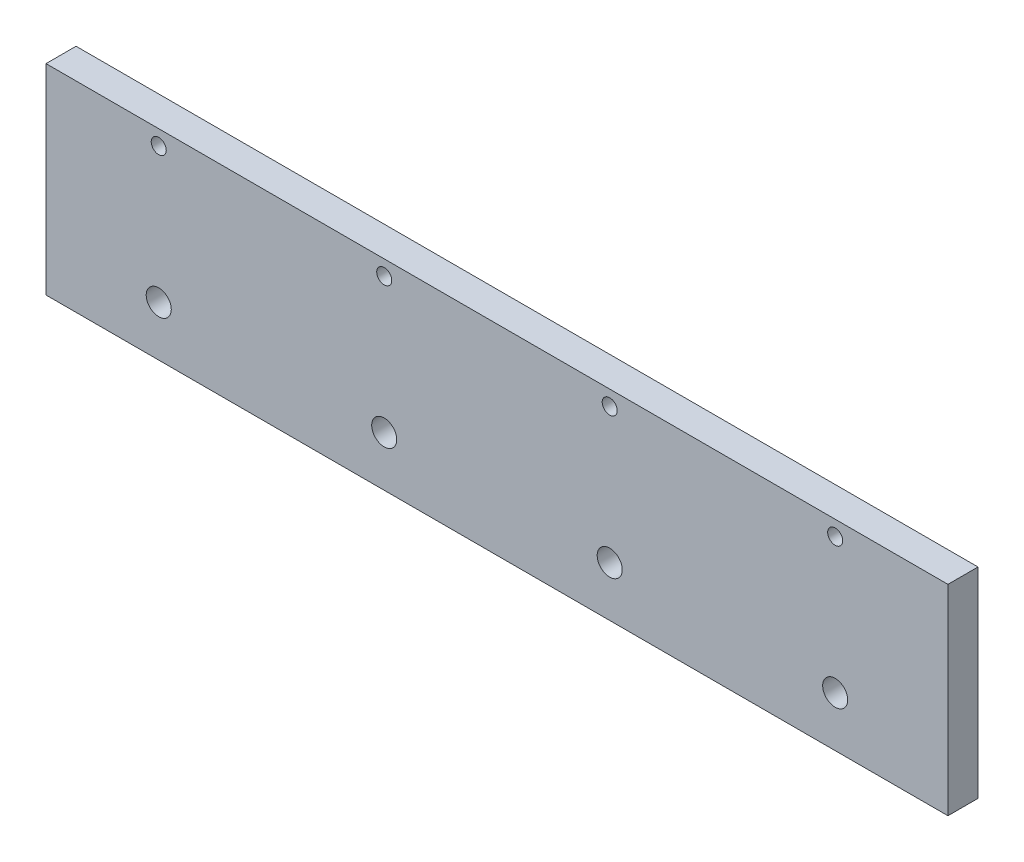
ISO-10303-21;
HEADER;
FILE_DESCRIPTION(('STEP AP214'),'2;1');
FILE_NAME('part.step','',(''),(''),'','','');
FILE_SCHEMA(('AUTOMOTIVE_DESIGN { 1 0 10303 214 1 1 1 1 }'));
ENDSEC;
DATA;
#1=APPLICATION_CONTEXT('core data for automotive mechanical design processes');
#2=APPLICATION_PROTOCOL_DEFINITION('international standard','automotive_design',2000,#1);
#3=PRODUCT_CONTEXT('',#1,'mechanical');
#4=PRODUCT('Part','Part','',(#3));
#5=PRODUCT_RELATED_PRODUCT_CATEGORY('part','',(#4));
#6=PRODUCT_DEFINITION_FORMATION('','',#4);
#7=PRODUCT_DEFINITION_CONTEXT('part definition',#1,'design');
#8=PRODUCT_DEFINITION('design','',#6,#7);
#9=PRODUCT_DEFINITION_SHAPE('','',#8);
#10=(LENGTH_UNIT() NAMED_UNIT(*) SI_UNIT(.MILLI.,.METRE.));
#11=(NAMED_UNIT(*) PLANE_ANGLE_UNIT() SI_UNIT($,.RADIAN.));
#12=(NAMED_UNIT(*) SI_UNIT($,.STERADIAN.) SOLID_ANGLE_UNIT());
#13=UNCERTAINTY_MEASURE_WITH_UNIT(LENGTH_MEASURE(1.E-05),#10,'distance_accuracy_value','');
#14=(GEOMETRIC_REPRESENTATION_CONTEXT(3) GLOBAL_UNCERTAINTY_ASSIGNED_CONTEXT((#13)) GLOBAL_UNIT_ASSIGNED_CONTEXT((#10,
#11,#12)) REPRESENTATION_CONTEXT('',''));
#15=CARTESIAN_POINT('',(0.,0.,0.));
#16=DIRECTION('',(0.,0.,1.));
#17=DIRECTION('',(1.,0.,0.));
#18=AXIS2_PLACEMENT_3D('',#15,#16,#17);
#19=CARTESIAN_POINT('',(180.,-40.,12.));
#20=DIRECTION('',(-1.,0.,0.));
#21=DIRECTION('',(0.,0.,1.));
#22=AXIS2_PLACEMENT_3D('',#19,#20,#21);
#23=PLANE('',#22);
#24=DIRECTION('',(0.,1.,0.));
#25=VECTOR('',#24,1.);
#26=CARTESIAN_POINT('',(180.,-40.,0.));
#27=LINE('',#26,#25);
#28=CARTESIAN_POINT('',(180.,-40.,0.));
#29=VERTEX_POINT('',#28);
#30=CARTESIAN_POINT('',(180.,40.,0.));
#31=VERTEX_POINT('',#30);
#32=EDGE_CURVE('E101',#29,#31,#27,.T.);
#33=ORIENTED_EDGE('',*,*,#32,.T.);
#34=DIRECTION('',(0.,0.,-1.));
#35=VECTOR('',#34,1.);
#36=CARTESIAN_POINT('',(180.,40.,12.));
#37=LINE('',#36,#35);
#38=CARTESIAN_POINT('',(180.,40.,12.));
#39=VERTEX_POINT('',#38);
#40=EDGE_CURVE('E92',#39,#31,#37,.T.);
#41=ORIENTED_EDGE('',*,*,#40,.F.);
#42=DIRECTION('',(0.,1.,0.));
#43=VECTOR('',#42,1.);
#44=CARTESIAN_POINT('',(180.,-40.,12.));
#45=LINE('',#44,#43);
#46=CARTESIAN_POINT('',(180.,-40.,12.));
#47=VERTEX_POINT('',#46);
#48=EDGE_CURVE('E86',#47,#39,#45,.T.);
#49=ORIENTED_EDGE('',*,*,#48,.F.);
#50=DIRECTION('',(0.,0.,-1.));
#51=VECTOR('',#50,1.);
#52=CARTESIAN_POINT('',(180.,-40.,12.));
#53=LINE('',#52,#51);
#54=EDGE_CURVE('E97',#47,#29,#53,.T.);
#55=ORIENTED_EDGE('',*,*,#54,.T.);
#56=EDGE_LOOP('',(#33,#41,#49,#55));
#57=FACE_BOUND('',#56,.T.);
#58=ADVANCED_FACE('F32',(#57),#23,.F.);
#59=CARTESIAN_POINT('',(-180.,40.,12.));
#60=DIRECTION('',(0.,-1.,0.));
#61=DIRECTION('',(0.,0.,-1.));
#62=AXIS2_PLACEMENT_3D('',#59,#60,#61);
#63=PLANE('',#62);
#64=DIRECTION('',(-1.,0.,0.));
#65=VECTOR('',#64,1.);
#66=CARTESIAN_POINT('',(-180.,40.,0.));
#67=LINE('',#66,#65);
#68=CARTESIAN_POINT('',(-180.,40.,0.));
#69=VERTEX_POINT('',#68);
#70=EDGE_CURVE('E91',#31,#69,#67,.T.);
#71=ORIENTED_EDGE('',*,*,#70,.T.);
#72=DIRECTION('',(0.,0.,-1.));
#73=VECTOR('',#72,1.);
#74=CARTESIAN_POINT('',(-180.,40.,12.));
#75=LINE('',#74,#73);
#76=CARTESIAN_POINT('',(-180.,40.,12.));
#77=VERTEX_POINT('',#76);
#78=EDGE_CURVE('E89',#77,#69,#75,.T.);
#79=ORIENTED_EDGE('',*,*,#78,.F.);
#80=DIRECTION('',(-1.,0.,0.));
#81=VECTOR('',#80,1.);
#82=CARTESIAN_POINT('',(-180.,40.,12.));
#83=LINE('',#82,#81);
#84=EDGE_CURVE('E80',#39,#77,#83,.T.);
#85=ORIENTED_EDGE('',*,*,#84,.F.);
#86=ORIENTED_EDGE('',*,*,#40,.T.);
#87=EDGE_LOOP('',(#71,#79,#85,#86));
#88=FACE_BOUND('',#87,.T.);
#89=ADVANCED_FACE('F90',(#88),#63,.F.);
#90=CARTESIAN_POINT('',(-180.,-40.,12.));
#91=DIRECTION('',(1.,0.,0.));
#92=DIRECTION('',(0.,0.,-1.));
#93=AXIS2_PLACEMENT_3D('',#90,#91,#92);
#94=PLANE('',#93);
#95=DIRECTION('',(0.,-1.,0.));
#96=VECTOR('',#95,1.);
#97=CARTESIAN_POINT('',(-180.,-40.,0.));
#98=LINE('',#97,#96);
#99=CARTESIAN_POINT('',(-180.,-40.,0.));
#100=VERTEX_POINT('',#99);
#101=EDGE_CURVE('E66',#69,#100,#98,.T.);
#102=ORIENTED_EDGE('',*,*,#101,.T.);
#103=DIRECTION('',(0.,0.,-1.));
#104=VECTOR('',#103,1.);
#105=CARTESIAN_POINT('',(-180.,-40.,12.));
#106=LINE('',#105,#104);
#107=CARTESIAN_POINT('',(-180.,-40.,12.));
#108=VERTEX_POINT('',#107);
#109=EDGE_CURVE('E93',#108,#100,#106,.T.);
#110=ORIENTED_EDGE('',*,*,#109,.F.);
#111=DIRECTION('',(0.,-1.,0.));
#112=VECTOR('',#111,1.);
#113=CARTESIAN_POINT('',(-180.,-40.,12.));
#114=LINE('',#113,#112);
#115=EDGE_CURVE('E84',#77,#108,#114,.T.);
#116=ORIENTED_EDGE('',*,*,#115,.F.);
#117=ORIENTED_EDGE('',*,*,#78,.T.);
#118=EDGE_LOOP('',(#102,#110,#116,#117));
#119=FACE_BOUND('',#118,.T.);
#120=ADVANCED_FACE('F95',(#119),#94,.F.);
#121=CARTESIAN_POINT('',(-180.,-40.,12.));
#122=DIRECTION('',(0.,1.,0.));
#123=DIRECTION('',(0.,0.,1.));
#124=AXIS2_PLACEMENT_3D('',#121,#122,#123);
#125=PLANE('',#124);
#126=DIRECTION('',(1.,0.,0.));
#127=VECTOR('',#126,1.);
#128=CARTESIAN_POINT('',(-180.,-40.,0.));
#129=LINE('',#128,#127);
#130=EDGE_CURVE('E72',#100,#29,#129,.T.);
#131=ORIENTED_EDGE('',*,*,#130,.T.);
#132=ORIENTED_EDGE('',*,*,#54,.F.);
#133=DIRECTION('',(1.,0.,0.));
#134=VECTOR('',#133,1.);
#135=CARTESIAN_POINT('',(-180.,-40.,12.));
#136=LINE('',#135,#134);
#137=EDGE_CURVE('E49',#108,#47,#136,.T.);
#138=ORIENTED_EDGE('',*,*,#137,.F.);
#139=ORIENTED_EDGE('',*,*,#109,.T.);
#140=EDGE_LOOP('',(#131,#132,#138,#139));
#141=FACE_BOUND('',#140,.T.);
#142=ADVANCED_FACE('F139',(#141),#125,.F.);
#143=CARTESIAN_POINT('',(180.,40.,12.));
#144=DIRECTION('',(0.,0.,-1.));
#145=DIRECTION('',(-1.,0.,0.));
#146=AXIS2_PLACEMENT_3D('',#143,#144,#145);
#147=PLANE('',#146);
#148=CARTESIAN_POINT('',(-45.,34.,12.));
#149=DIRECTION('',(0.,0.,1.));
#150=DIRECTION('',(1.,0.,0.));
#151=AXIS2_PLACEMENT_3D('',#148,#149,#150);
#152=CIRCLE('',#151,2.99999999999999);
#153=CARTESIAN_POINT('',(-42.,34.,12.));
#154=VERTEX_POINT('',#153);
#155=EDGE_CURVE('E222',#154,#154,#152,.T.);
#156=ORIENTED_EDGE('',*,*,#155,.F.);
#157=EDGE_LOOP('',(#156));
#158=FACE_BOUND('',#157,.T.);
#159=CARTESIAN_POINT('',(-45.,-20.,12.));
#160=DIRECTION('',(0.,0.,1.));
#161=DIRECTION('',(1.,0.,0.));
#162=AXIS2_PLACEMENT_3D('',#159,#160,#161);
#163=CIRCLE('',#162,4.99999999999999);
#164=CARTESIAN_POINT('',(-40.,-20.,12.));
#165=VERTEX_POINT('',#164);
#166=EDGE_CURVE('E214',#165,#165,#163,.T.);
#167=ORIENTED_EDGE('',*,*,#166,.F.);
#168=EDGE_LOOP('',(#167));
#169=FACE_BOUND('',#168,.T.);
#170=CARTESIAN_POINT('',(-135.,-20.,12.));
#171=DIRECTION('',(0.,0.,1.));
#172=DIRECTION('',(1.,0.,0.));
#173=AXIS2_PLACEMENT_3D('',#170,#171,#172);
#174=CIRCLE('',#173,4.99999999999999);
#175=CARTESIAN_POINT('',(-130.,-20.,12.));
#176=VERTEX_POINT('',#175);
#177=EDGE_CURVE('E208',#176,#176,#174,.T.);
#178=ORIENTED_EDGE('',*,*,#177,.F.);
#179=EDGE_LOOP('',(#178));
#180=FACE_BOUND('',#179,.T.);
#181=CARTESIAN_POINT('',(-135.,34.,12.));
#182=DIRECTION('',(0.,0.,1.));
#183=DIRECTION('',(1.,0.,0.));
#184=AXIS2_PLACEMENT_3D('',#181,#182,#183);
#185=CIRCLE('',#184,2.99999999999999);
#186=CARTESIAN_POINT('',(-132.,34.,12.));
#187=VERTEX_POINT('',#186);
#188=EDGE_CURVE('E104',#187,#187,#185,.T.);
#189=ORIENTED_EDGE('',*,*,#188,.F.);
#190=EDGE_LOOP('',(#189));
#191=FACE_BOUND('',#190,.T.);
#192=ORIENTED_EDGE('',*,*,#48,.T.);
#193=ORIENTED_EDGE('',*,*,#84,.T.);
#194=ORIENTED_EDGE('',*,*,#115,.T.);
#195=ORIENTED_EDGE('',*,*,#137,.T.);
#196=EDGE_LOOP('',(#192,#193,#194,#195));
#197=FACE_BOUND('',#196,.T.);
#198=CARTESIAN_POINT('',(45.,-20.,12.));
#199=DIRECTION('',(0.,0.,1.));
#200=DIRECTION('',(1.,0.,0.));
#201=AXIS2_PLACEMENT_3D('',#198,#199,#200);
#202=CIRCLE('',#201,4.99999999999999);
#203=CARTESIAN_POINT('',(50.,-20.,12.));
#204=VERTEX_POINT('',#203);
#205=EDGE_CURVE('E114',#204,#204,#202,.T.);
#206=ORIENTED_EDGE('',*,*,#205,.F.);
#207=EDGE_LOOP('',(#206));
#208=FACE_BOUND('',#207,.T.);
#209=CARTESIAN_POINT('',(135.,-20.,12.));
#210=DIRECTION('',(0.,0.,1.));
#211=DIRECTION('',(1.,0.,0.));
#212=AXIS2_PLACEMENT_3D('',#209,#210,#211);
#213=CIRCLE('',#212,4.99999999999999);
#214=CARTESIAN_POINT('',(140.,-20.,12.));
#215=VERTEX_POINT('',#214);
#216=EDGE_CURVE('E120',#215,#215,#213,.T.);
#217=ORIENTED_EDGE('',*,*,#216,.F.);
#218=EDGE_LOOP('',(#217));
#219=FACE_BOUND('',#218,.T.);
#220=CARTESIAN_POINT('',(45.,34.,12.));
#221=DIRECTION('',(0.,0.,1.));
#222=DIRECTION('',(1.,0.,0.));
#223=AXIS2_PLACEMENT_3D('',#220,#221,#222);
#224=CIRCLE('',#223,2.99999999999999);
#225=CARTESIAN_POINT('',(48.,34.,12.));
#226=VERTEX_POINT('',#225);
#227=EDGE_CURVE('E126',#226,#226,#224,.T.);
#228=ORIENTED_EDGE('',*,*,#227,.F.);
#229=EDGE_LOOP('',(#228));
#230=FACE_BOUND('',#229,.T.);
#231=CARTESIAN_POINT('',(135.,34.,12.));
#232=DIRECTION('',(0.,0.,1.));
#233=DIRECTION('',(1.,0.,0.));
#234=AXIS2_PLACEMENT_3D('',#231,#232,#233);
#235=CIRCLE('',#234,2.99999999999999);
#236=CARTESIAN_POINT('',(138.,34.,12.));
#237=VERTEX_POINT('',#236);
#238=EDGE_CURVE('E11',#237,#237,#235,.T.);
#239=ORIENTED_EDGE('',*,*,#238,.F.);
#240=EDGE_LOOP('',(#239));
#241=FACE_BOUND('',#240,.T.);
#242=ADVANCED_FACE('F81',(#158,#169,#180,#191,#197,#208,#219,#230,#241),#147,.F.);
#243=CARTESIAN_POINT('',(180.,40.,0.));
#244=DIRECTION('',(0.,0.,-1.));
#245=DIRECTION('',(-1.,0.,0.));
#246=AXIS2_PLACEMENT_3D('',#243,#244,#245);
#247=PLANE('',#246);
#248=CARTESIAN_POINT('',(-45.,34.,0.));
#249=DIRECTION('',(0.,0.,-1.));
#250=DIRECTION('',(-1.,0.,0.));
#251=AXIS2_PLACEMENT_3D('',#248,#249,#250);
#252=CIRCLE('',#251,2.99999999999999);
#253=CARTESIAN_POINT('',(-48.,34.,0.));
#254=VERTEX_POINT('',#253);
#255=EDGE_CURVE('E225',#254,#254,#252,.F.);
#256=ORIENTED_EDGE('',*,*,#255,.T.);
#257=EDGE_LOOP('',(#256));
#258=FACE_BOUND('',#257,.T.);
#259=CARTESIAN_POINT('',(-45.,-20.,0.));
#260=DIRECTION('',(0.,0.,-1.));
#261=DIRECTION('',(-1.,0.,0.));
#262=AXIS2_PLACEMENT_3D('',#259,#260,#261);
#263=CIRCLE('',#262,4.99999999999999);
#264=CARTESIAN_POINT('',(-50.,-20.,0.));
#265=VERTEX_POINT('',#264);
#266=EDGE_CURVE('E219',#265,#265,#263,.F.);
#267=ORIENTED_EDGE('',*,*,#266,.T.);
#268=EDGE_LOOP('',(#267));
#269=FACE_BOUND('',#268,.T.);
#270=CARTESIAN_POINT('',(-135.,-20.,0.));
#271=DIRECTION('',(0.,0.,-1.));
#272=DIRECTION('',(-1.,0.,0.));
#273=AXIS2_PLACEMENT_3D('',#270,#271,#272);
#274=CIRCLE('',#273,4.99999999999999);
#275=CARTESIAN_POINT('',(-140.,-20.,0.));
#276=VERTEX_POINT('',#275);
#277=EDGE_CURVE('E211',#276,#276,#274,.F.);
#278=ORIENTED_EDGE('',*,*,#277,.T.);
#279=EDGE_LOOP('',(#278));
#280=FACE_BOUND('',#279,.T.);
#281=CARTESIAN_POINT('',(-135.,34.,0.));
#282=DIRECTION('',(0.,0.,-1.));
#283=DIRECTION('',(-1.,0.,0.));
#284=AXIS2_PLACEMENT_3D('',#281,#282,#283);
#285=CIRCLE('',#284,2.99999999999999);
#286=CARTESIAN_POINT('',(-138.,34.,0.));
#287=VERTEX_POINT('',#286);
#288=EDGE_CURVE('E203',#287,#287,#285,.F.);
#289=ORIENTED_EDGE('',*,*,#288,.T.);
#290=EDGE_LOOP('',(#289));
#291=FACE_BOUND('',#290,.T.);
#292=ORIENTED_EDGE('',*,*,#32,.F.);
#293=ORIENTED_EDGE('',*,*,#130,.F.);
#294=ORIENTED_EDGE('',*,*,#101,.F.);
#295=ORIENTED_EDGE('',*,*,#70,.F.);
#296=EDGE_LOOP('',(#292,#293,#294,#295));
#297=FACE_BOUND('',#296,.T.);
#298=CARTESIAN_POINT('',(45.,-20.,0.));
#299=DIRECTION('',(0.,0.,-1.));
#300=DIRECTION('',(-1.,0.,0.));
#301=AXIS2_PLACEMENT_3D('',#298,#299,#300);
#302=CIRCLE('',#301,4.99999999999999);
#303=CARTESIAN_POINT('',(40.,-20.,0.));
#304=VERTEX_POINT('',#303);
#305=EDGE_CURVE('E111',#304,#304,#302,.F.);
#306=ORIENTED_EDGE('',*,*,#305,.T.);
#307=EDGE_LOOP('',(#306));
#308=FACE_BOUND('',#307,.T.);
#309=CARTESIAN_POINT('',(135.,-20.,0.));
#310=DIRECTION('',(0.,0.,-1.));
#311=DIRECTION('',(-1.,0.,0.));
#312=AXIS2_PLACEMENT_3D('',#309,#310,#311);
#313=CIRCLE('',#312,4.99999999999999);
#314=CARTESIAN_POINT('',(130.,-20.,0.));
#315=VERTEX_POINT('',#314);
#316=EDGE_CURVE('E117',#315,#315,#313,.F.);
#317=ORIENTED_EDGE('',*,*,#316,.T.);
#318=EDGE_LOOP('',(#317));
#319=FACE_BOUND('',#318,.T.);
#320=CARTESIAN_POINT('',(45.,34.,0.));
#321=DIRECTION('',(0.,0.,-1.));
#322=DIRECTION('',(-1.,0.,0.));
#323=AXIS2_PLACEMENT_3D('',#320,#321,#322);
#324=CIRCLE('',#323,2.99999999999999);
#325=CARTESIAN_POINT('',(42.,34.,0.));
#326=VERTEX_POINT('',#325);
#327=EDGE_CURVE('E123',#326,#326,#324,.F.);
#328=ORIENTED_EDGE('',*,*,#327,.T.);
#329=EDGE_LOOP('',(#328));
#330=FACE_BOUND('',#329,.T.);
#331=CARTESIAN_POINT('',(135.,34.,0.));
#332=DIRECTION('',(0.,0.,-1.));
#333=DIRECTION('',(-1.,0.,0.));
#334=AXIS2_PLACEMENT_3D('',#331,#332,#333);
#335=CIRCLE('',#334,2.99999999999999);
#336=CARTESIAN_POINT('',(132.,34.,0.));
#337=VERTEX_POINT('',#336);
#338=EDGE_CURVE('E41',#337,#337,#335,.F.);
#339=ORIENTED_EDGE('',*,*,#338,.T.);
#340=EDGE_LOOP('',(#339));
#341=FACE_BOUND('',#340,.T.);
#342=ADVANCED_FACE('F131',(#258,#269,#280,#291,#297,#308,#319,#330,#341),#247,.T.);
#343=CARTESIAN_POINT('',(-135.,34.,-0.000999999999999265));
#344=DIRECTION('',(0.,0.,1.));
#345=DIRECTION('',(1.,0.,0.));
#346=AXIS2_PLACEMENT_3D('',#343,#344,#345);
#347=CYLINDRICAL_SURFACE('',#346,2.99999999999999);
#348=ORIENTED_EDGE('',*,*,#288,.F.);
#349=EDGE_LOOP('',(#348));
#350=FACE_BOUND('',#349,.T.);
#351=ORIENTED_EDGE('',*,*,#188,.T.);
#352=EDGE_LOOP('',(#351));
#353=FACE_BOUND('',#352,.T.);
#354=ADVANCED_FACE('F146',(#350,#353),#347,.F.);
#355=CARTESIAN_POINT('',(-135.,-20.,-0.000999999999999265));
#356=DIRECTION('',(0.,0.,1.));
#357=DIRECTION('',(1.,0.,0.));
#358=AXIS2_PLACEMENT_3D('',#355,#356,#357);
#359=CYLINDRICAL_SURFACE('',#358,4.99999999999999);
#360=ORIENTED_EDGE('',*,*,#277,.F.);
#361=EDGE_LOOP('',(#360));
#362=FACE_BOUND('',#361,.T.);
#363=ORIENTED_EDGE('',*,*,#177,.T.);
#364=EDGE_LOOP('',(#363));
#365=FACE_BOUND('',#364,.T.);
#366=ADVANCED_FACE('F191',(#362,#365),#359,.F.);
#367=CARTESIAN_POINT('',(-45.,-20.,-0.000999999999999265));
#368=DIRECTION('',(0.,0.,1.));
#369=DIRECTION('',(1.,0.,0.));
#370=AXIS2_PLACEMENT_3D('',#367,#368,#369);
#371=CYLINDRICAL_SURFACE('',#370,4.99999999999999);
#372=ORIENTED_EDGE('',*,*,#266,.F.);
#373=EDGE_LOOP('',(#372));
#374=FACE_BOUND('',#373,.T.);
#375=ORIENTED_EDGE('',*,*,#166,.T.);
#376=EDGE_LOOP('',(#375));
#377=FACE_BOUND('',#376,.T.);
#378=ADVANCED_FACE('F167',(#374,#377),#371,.F.);
#379=CARTESIAN_POINT('',(45.,-20.,-0.000999999999999265));
#380=DIRECTION('',(0.,0.,1.));
#381=DIRECTION('',(1.,0.,0.));
#382=AXIS2_PLACEMENT_3D('',#379,#380,#381);
#383=CYLINDRICAL_SURFACE('',#382,4.99999999999999);
#384=ORIENTED_EDGE('',*,*,#305,.F.);
#385=EDGE_LOOP('',(#384));
#386=FACE_BOUND('',#385,.T.);
#387=ORIENTED_EDGE('',*,*,#205,.T.);
#388=EDGE_LOOP('',(#387));
#389=FACE_BOUND('',#388,.T.);
#390=ADVANCED_FACE('F163',(#386,#389),#383,.F.);
#391=CARTESIAN_POINT('',(135.,-20.,-0.000999999999999265));
#392=DIRECTION('',(0.,0.,1.));
#393=DIRECTION('',(1.,0.,0.));
#394=AXIS2_PLACEMENT_3D('',#391,#392,#393);
#395=CYLINDRICAL_SURFACE('',#394,4.99999999999999);
#396=ORIENTED_EDGE('',*,*,#316,.F.);
#397=EDGE_LOOP('',(#396));
#398=FACE_BOUND('',#397,.T.);
#399=ORIENTED_EDGE('',*,*,#216,.T.);
#400=EDGE_LOOP('',(#399));
#401=FACE_BOUND('',#400,.T.);
#402=ADVANCED_FACE('F166',(#398,#401),#395,.F.);
#403=CARTESIAN_POINT('',(-45.,34.,-0.000999999999999265));
#404=DIRECTION('',(0.,0.,1.));
#405=DIRECTION('',(1.,0.,0.));
#406=AXIS2_PLACEMENT_3D('',#403,#404,#405);
#407=CYLINDRICAL_SURFACE('',#406,2.99999999999999);
#408=ORIENTED_EDGE('',*,*,#255,.F.);
#409=EDGE_LOOP('',(#408));
#410=FACE_BOUND('',#409,.T.);
#411=ORIENTED_EDGE('',*,*,#155,.T.);
#412=EDGE_LOOP('',(#411));
#413=FACE_BOUND('',#412,.T.);
#414=ADVANCED_FACE('F170',(#410,#413),#407,.F.);
#415=CARTESIAN_POINT('',(45.,34.,-0.000999999999999265));
#416=DIRECTION('',(0.,0.,1.));
#417=DIRECTION('',(1.,0.,0.));
#418=AXIS2_PLACEMENT_3D('',#415,#416,#417);
#419=CYLINDRICAL_SURFACE('',#418,2.99999999999999);
#420=ORIENTED_EDGE('',*,*,#327,.F.);
#421=EDGE_LOOP('',(#420));
#422=FACE_BOUND('',#421,.T.);
#423=ORIENTED_EDGE('',*,*,#227,.T.);
#424=EDGE_LOOP('',(#423));
#425=FACE_BOUND('',#424,.T.);
#426=ADVANCED_FACE('F135',(#422,#425),#419,.F.);
#427=CARTESIAN_POINT('',(135.,34.,-0.000999999999999265));
#428=DIRECTION('',(0.,0.,1.));
#429=DIRECTION('',(1.,0.,0.));
#430=AXIS2_PLACEMENT_3D('',#427,#428,#429);
#431=CYLINDRICAL_SURFACE('',#430,2.99999999999999);
#432=ORIENTED_EDGE('',*,*,#338,.F.);
#433=EDGE_LOOP('',(#432));
#434=FACE_BOUND('',#433,.T.);
#435=ORIENTED_EDGE('',*,*,#238,.T.);
#436=EDGE_LOOP('',(#435));
#437=FACE_BOUND('',#436,.T.);
#438=ADVANCED_FACE('F34',(#434,#437),#431,.F.);
#439=CLOSED_SHELL('',(#58,#89,#120,#142,#242,#342,#354,#366,#378,#390,#402,#414,#426,#438));
#440=MANIFOLD_SOLID_BREP('B2',#439);
#441=ADVANCED_BREP_SHAPE_REPRESENTATION('',(#18,#440),#14);
#442=SHAPE_DEFINITION_REPRESENTATION(#9,#441);
ENDSEC;
END-ISO-10303-21;
